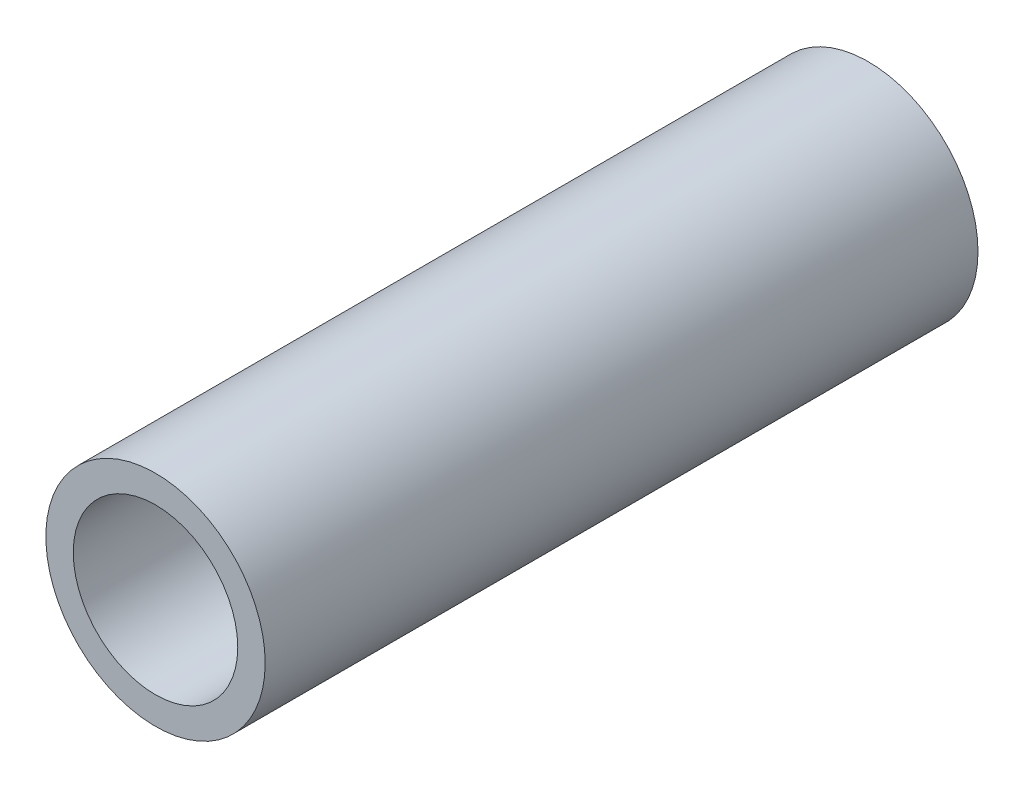
ISO-10303-21;
HEADER;
FILE_DESCRIPTION(('STEP AP214'),'2;1');
FILE_NAME('part.step','',(''),(''),'','','');
FILE_SCHEMA(('AUTOMOTIVE_DESIGN { 1 0 10303 214 1 1 1 1 }'));
ENDSEC;
DATA;
#1=APPLICATION_CONTEXT('core data for automotive mechanical design processes');
#2=APPLICATION_PROTOCOL_DEFINITION('international standard','automotive_design',2000,#1);
#3=PRODUCT_CONTEXT('',#1,'mechanical');
#4=PRODUCT('Part','Part','',(#3));
#5=PRODUCT_RELATED_PRODUCT_CATEGORY('part','',(#4));
#6=PRODUCT_DEFINITION_FORMATION('','',#4);
#7=PRODUCT_DEFINITION_CONTEXT('part definition',#1,'design');
#8=PRODUCT_DEFINITION('design','',#6,#7);
#9=PRODUCT_DEFINITION_SHAPE('','',#8);
#10=(LENGTH_UNIT() NAMED_UNIT(*) SI_UNIT(.MILLI.,.METRE.));
#11=(NAMED_UNIT(*) PLANE_ANGLE_UNIT() SI_UNIT($,.RADIAN.));
#12=(NAMED_UNIT(*) SI_UNIT($,.STERADIAN.) SOLID_ANGLE_UNIT());
#13=UNCERTAINTY_MEASURE_WITH_UNIT(LENGTH_MEASURE(1.E-05),#10,'distance_accuracy_value','');
#14=(GEOMETRIC_REPRESENTATION_CONTEXT(3) GLOBAL_UNCERTAINTY_ASSIGNED_CONTEXT((#13)) GLOBAL_UNIT_ASSIGNED_CONTEXT((#10,
#11,#12)) REPRESENTATION_CONTEXT('',''));
#15=CARTESIAN_POINT('',(0.,0.,0.));
#16=DIRECTION('',(0.,0.,1.));
#17=DIRECTION('',(1.,0.,0.));
#18=AXIS2_PLACEMENT_3D('',#15,#16,#17);
#19=CARTESIAN_POINT('',(0.,0.,130.));
#20=DIRECTION('',(0.,0.,-1.));
#21=DIRECTION('',(-1.,0.,0.));
#22=AXIS2_PLACEMENT_3D('',#19,#20,#21);
#23=CYLINDRICAL_SURFACE('',#22,20.);
#24=CARTESIAN_POINT('',(0.,0.,130.));
#25=DIRECTION('',(0.,0.,1.));
#26=DIRECTION('',(1.,0.,0.));
#27=AXIS2_PLACEMENT_3D('',#24,#25,#26);
#28=CIRCLE('',#27,20.);
#29=CARTESIAN_POINT('',(20.,0.,130.));
#30=VERTEX_POINT('',#29);
#31=EDGE_CURVE('E10',#30,#30,#28,.T.);
#32=ORIENTED_EDGE('',*,*,#31,.F.);
#33=EDGE_LOOP('',(#32));
#34=FACE_BOUND('',#33,.T.);
#35=CARTESIAN_POINT('',(0.,0.,0.));
#36=DIRECTION('',(0.,0.,1.));
#37=DIRECTION('',(1.,0.,0.));
#38=AXIS2_PLACEMENT_3D('',#35,#36,#37);
#39=CIRCLE('',#38,20.);
#40=CARTESIAN_POINT('',(20.,0.,0.));
#41=VERTEX_POINT('',#40);
#42=EDGE_CURVE('E34',#41,#41,#39,.T.);
#43=ORIENTED_EDGE('',*,*,#42,.T.);
#44=EDGE_LOOP('',(#43));
#45=FACE_BOUND('',#44,.T.);
#46=ADVANCED_FACE('F31',(#34,#45),#23,.T.);
#47=CARTESIAN_POINT('',(0.,0.,130.));
#48=DIRECTION('',(0.,0.,1.));
#49=DIRECTION('',(1.,0.,0.));
#50=AXIS2_PLACEMENT_3D('',#47,#48,#49);
#51=PLANE('',#50);
#52=CARTESIAN_POINT('',(0.,0.,130.));
#53=DIRECTION('',(0.,0.,1.));
#54=DIRECTION('',(1.,0.,0.));
#55=AXIS2_PLACEMENT_3D('',#52,#53,#54);
#56=CIRCLE('',#55,15.);
#57=CARTESIAN_POINT('',(15.,0.,130.));
#58=VERTEX_POINT('',#57);
#59=EDGE_CURVE('E43',#58,#58,#56,.T.);
#60=ORIENTED_EDGE('',*,*,#59,.F.);
#61=EDGE_LOOP('',(#60));
#62=FACE_BOUND('',#61,.T.);
#63=ORIENTED_EDGE('',*,*,#31,.T.);
#64=EDGE_LOOP('',(#63));
#65=FACE_BOUND('',#64,.T.);
#66=ADVANCED_FACE('F58',(#62,#65),#51,.T.);
#67=CARTESIAN_POINT('',(0.,0.,0.));
#68=DIRECTION('',(0.,0.,1.));
#69=DIRECTION('',(1.,0.,0.));
#70=AXIS2_PLACEMENT_3D('',#67,#68,#69);
#71=PLANE('',#70);
#72=CARTESIAN_POINT('',(0.,0.,0.));
#73=DIRECTION('',(0.,0.,1.));
#74=DIRECTION('',(1.,0.,0.));
#75=AXIS2_PLACEMENT_3D('',#72,#73,#74);
#76=CIRCLE('',#75,15.);
#77=CARTESIAN_POINT('',(15.,0.,0.));
#78=VERTEX_POINT('',#77);
#79=EDGE_CURVE('E41',#78,#78,#76,.T.);
#80=ORIENTED_EDGE('',*,*,#79,.T.);
#81=EDGE_LOOP('',(#80));
#82=FACE_BOUND('',#81,.T.);
#83=ORIENTED_EDGE('',*,*,#42,.F.);
#84=EDGE_LOOP('',(#83));
#85=FACE_BOUND('',#84,.T.);
#86=ADVANCED_FACE('F49',(#82,#85),#71,.F.);
#87=CARTESIAN_POINT('',(0.,0.,0.));
#88=DIRECTION('',(0.,0.,1.));
#89=DIRECTION('',(1.,0.,0.));
#90=AXIS2_PLACEMENT_3D('',#87,#88,#89);
#91=CYLINDRICAL_SURFACE('',#90,15.);
#92=ORIENTED_EDGE('',*,*,#79,.F.);
#93=EDGE_LOOP('',(#92));
#94=FACE_BOUND('',#93,.T.);
#95=ORIENTED_EDGE('',*,*,#59,.T.);
#96=EDGE_LOOP('',(#95));
#97=FACE_BOUND('',#96,.T.);
#98=ADVANCED_FACE('F52',(#94,#97),#91,.F.);
#99=CLOSED_SHELL('',(#46,#66,#86,#98));
#100=MANIFOLD_SOLID_BREP('B2',#99);
#101=ADVANCED_BREP_SHAPE_REPRESENTATION('',(#18,#100),#14);
#102=SHAPE_DEFINITION_REPRESENTATION(#9,#101);
ENDSEC;
END-ISO-10303-21;
